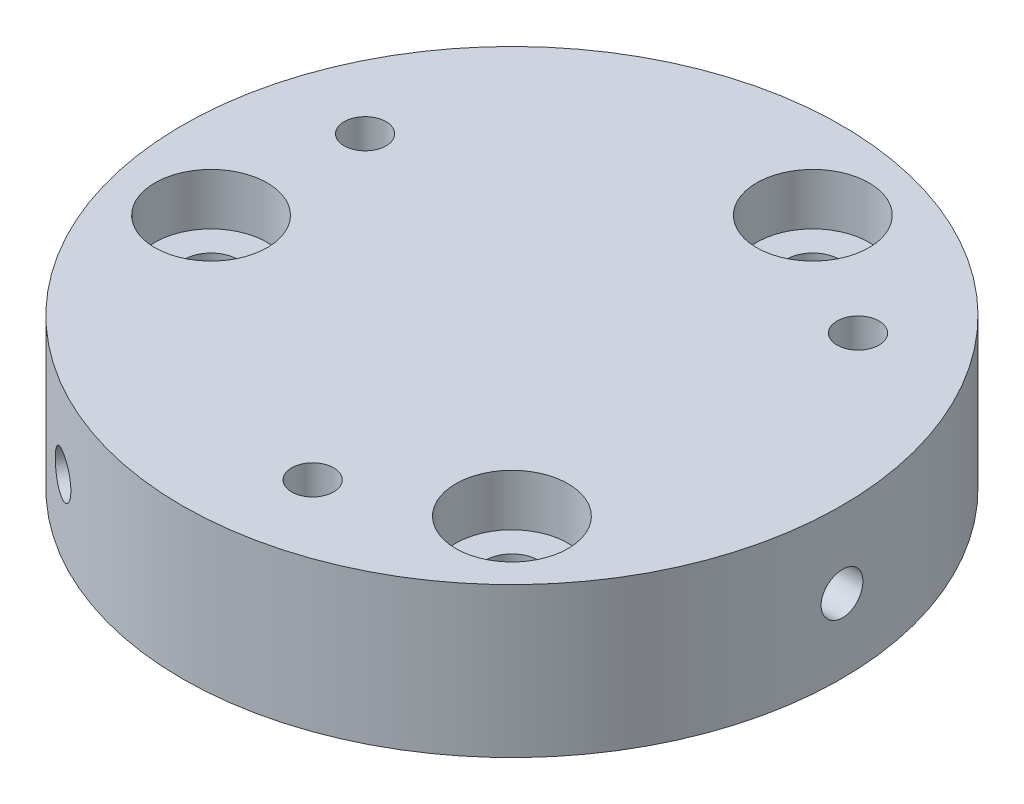
ISO-10303-21;
HEADER;
FILE_DESCRIPTION(('STEP AP214'),'2;1');
FILE_NAME('part.step','',(''),(''),'','','');
FILE_SCHEMA(('AUTOMOTIVE_DESIGN { 1 0 10303 214 1 1 1 1 }'));
ENDSEC;
DATA;
#1=APPLICATION_CONTEXT('core data for automotive mechanical design processes');
#2=APPLICATION_PROTOCOL_DEFINITION('international standard','automotive_design',2000,#1);
#3=PRODUCT_CONTEXT('',#1,'mechanical');
#4=PRODUCT('Part','Part','',(#3));
#5=PRODUCT_RELATED_PRODUCT_CATEGORY('part','',(#4));
#6=PRODUCT_DEFINITION_FORMATION('','',#4);
#7=PRODUCT_DEFINITION_CONTEXT('part definition',#1,'design');
#8=PRODUCT_DEFINITION('design','',#6,#7);
#9=PRODUCT_DEFINITION_SHAPE('','',#8);
#10=(LENGTH_UNIT() NAMED_UNIT(*) SI_UNIT(.MILLI.,.METRE.));
#11=(NAMED_UNIT(*) PLANE_ANGLE_UNIT() SI_UNIT($,.RADIAN.));
#12=(NAMED_UNIT(*) SI_UNIT($,.STERADIAN.) SOLID_ANGLE_UNIT());
#13=UNCERTAINTY_MEASURE_WITH_UNIT(LENGTH_MEASURE(1.E-05),#10,'distance_accuracy_value','');
#14=(GEOMETRIC_REPRESENTATION_CONTEXT(3) GLOBAL_UNCERTAINTY_ASSIGNED_CONTEXT((#13)) GLOBAL_UNIT_ASSIGNED_CONTEXT((#10,
#11,#12)) REPRESENTATION_CONTEXT('',''));
#15=CARTESIAN_POINT('',(0.,0.,0.));
#16=DIRECTION('',(0.,0.,1.));
#17=DIRECTION('',(1.,0.,0.));
#18=AXIS2_PLACEMENT_3D('',#15,#16,#17);
#19=CARTESIAN_POINT('',(0.,6.35,0.));
#20=DIRECTION('',(0.,-1.,0.));
#21=DIRECTION('',(0.,0.,-1.));
#22=AXIS2_PLACEMENT_3D('',#19,#20,#21);
#23=CYLINDRICAL_SURFACE('',#22,13.97);
#24=CARTESIAN_POINT('',(13.938479425979,3.10562907168175,-0.937918595380138));
#25=CARTESIAN_POINT('',(13.9384798123042,3.05574782331363,-0.937916402544638));
#26=CARTESIAN_POINT('',(13.9387647865163,3.00583169363299,-0.933707252486993));
#27=CARTESIAN_POINT('',(13.939875236483,2.90737787517931,-0.916976536175207));
#28=CARTESIAN_POINT('',(13.9407013405568,2.85884185732844,-0.904445306716632));
#29=CARTESIAN_POINT('',(13.9428038338316,2.76458862175944,-0.871431713651232));
#30=CARTESIAN_POINT('',(13.9440799844859,2.71886992577468,-0.850953561726351));
#31=CARTESIAN_POINT('',(13.9469445298876,2.6315314518237,-0.802633914107205));
#32=CARTESIAN_POINT('',(13.9485328533404,2.58991074120227,-0.774794099185005));
#33=CARTESIAN_POINT('',(13.9518537986137,2.51187314480426,-0.712493588303495));
#34=CARTESIAN_POINT('',(13.9535866152013,2.47546346864958,-0.678023871203535));
#35=CARTESIAN_POINT('',(13.9570099140388,2.40894319032042,-0.603460184122266));
#36=CARTESIAN_POINT('',(13.9587003945163,2.37883285146058,-0.563365979152257));
#37=CARTESIAN_POINT('',(13.9618619568109,2.32574383039153,-0.478650327019247));
#38=CARTESIAN_POINT('',(13.9633328547612,2.30277110763143,-0.434025137797455));
#39=CARTESIAN_POINT('',(13.9659009077045,2.26464758936021,-0.341540102584412));
#40=CARTESIAN_POINT('',(13.9669980668175,2.24949670762206,-0.293680292257818));
#41=CARTESIAN_POINT('',(13.9687078069622,2.22746693787532,-0.196153701650536));
#42=CARTESIAN_POINT('',(13.9693210485641,2.22057676690943,-0.146489481746137));
#43=CARTESIAN_POINT('',(13.9700110051462,2.21522916054317,-0.0467057369814023));
#44=CARTESIAN_POINT('',(13.9700877263596,2.21677162717229,0.00341378258250156));
#45=CARTESIAN_POINT('',(13.9697111129552,2.22823620664003,0.102608957958117));
#46=CARTESIAN_POINT('',(13.9692585457138,2.23814618225657,0.151686020226645));
#47=CARTESIAN_POINT('',(13.9678899531263,2.26604563547726,0.247480303593779));
#48=CARTESIAN_POINT('',(13.96697392496,2.28403516224325,0.294197510331397));
#49=CARTESIAN_POINT('',(13.9647941725981,2.3275967941837,0.383984580791216));
#50=CARTESIAN_POINT('',(13.9635301963752,2.35317439663278,0.427051771031658));
#51=CARTESIAN_POINT('',(13.9608094021003,2.41118212611358,0.508286665190614));
#52=CARTESIAN_POINT('',(13.959352581796,2.44361233318274,0.546454311874785));
#53=CARTESIAN_POINT('',(13.9564182317809,2.51447323916838,0.616877067527077));
#54=CARTESIAN_POINT('',(13.9549406699363,2.55291447335717,0.649121575284797));
#55=CARTESIAN_POINT('',(13.9521434922829,2.63466932624759,0.706700524130587));
#56=CARTESIAN_POINT('',(13.9508238765394,2.67798294696504,0.732034962359785));
#57=CARTESIAN_POINT('',(13.9484991294586,2.76825982894961,0.775073463492338));
#58=CARTESIAN_POINT('',(13.94749401673,2.81522330596985,0.792777074910824));
#59=CARTESIAN_POINT('',(13.9459175546699,2.91146366766766,0.820043718673101));
#60=CARTESIAN_POINT('',(13.9453462000475,2.96074052411902,0.829606850314013));
#61=CARTESIAN_POINT('',(13.9447055296932,3.06011636782764,0.840307671547019));
#62=CARTESIAN_POINT('',(13.9446353355671,3.11021376231064,0.841460102822821));
#63=CARTESIAN_POINT('',(13.9450029484655,3.20988989761212,0.835345309247503));
#64=CARTESIAN_POINT('',(13.9454407527484,3.25946864122835,0.828078129838039));
#65=CARTESIAN_POINT('',(13.9467720692114,3.35665840694636,0.805342788637999));
#66=CARTESIAN_POINT('',(13.9476652038716,3.40427102389161,0.789881420328618));
#67=CARTESIAN_POINT('',(13.9498016432069,3.49622622195101,0.751203755551211));
#68=CARTESIAN_POINT('',(13.9510449511741,3.54056877231698,0.727987386174881));
#69=CARTESIAN_POINT('',(13.9537368854457,3.62479280242782,0.674421485897712));
#70=CARTESIAN_POINT('',(13.9551857948497,3.66466799312794,0.644062080931192));
#71=CARTESIAN_POINT('',(13.9581156147561,3.73876202968895,0.577086729976687));
#72=CARTESIAN_POINT('',(13.9595965255828,3.77298081818856,0.540470720548449));
#73=CARTESIAN_POINT('',(13.9624151407836,3.83484051191047,0.461958577705745));
#74=CARTESIAN_POINT('',(13.9637526359541,3.86247187784163,0.420054919798023));
#75=CARTESIAN_POINT('',(13.966118822522,3.91030708757418,0.332195247290731));
#76=CARTESIAN_POINT('',(13.9671475158808,3.93051097855051,0.286239258431476));
#77=CARTESIAN_POINT('',(13.968765848019,3.96290114161872,0.191614828870857));
#78=CARTESIAN_POINT('',(13.9693558171,3.97509344457163,0.142948458461878));
#79=CARTESIAN_POINT('',(13.970017018193,3.99113407245889,0.0442561638739929));
#80=CARTESIAN_POINT('',(13.9700882555308,3.99498248305793,-0.00576974634151527));
#81=CARTESIAN_POINT('',(13.969689516486,3.99422524539626,-0.105666592523406));
#82=CARTESIAN_POINT('',(13.9692204961881,3.98963452316739,-0.155537646134647));
#83=CARTESIAN_POINT('',(13.9677808594512,3.97216028892392,-0.253797491762996));
#84=CARTESIAN_POINT('',(13.966810242138,3.95927676245398,-0.302186281196191));
#85=CARTESIAN_POINT('',(13.9644622259964,3.92558602452528,-0.39611043997639));
#86=CARTESIAN_POINT('',(13.9630848307923,3.90477888366231,-0.441645834741632));
#87=CARTESIAN_POINT('',(13.9600644551051,3.85583360900213,-0.528577829492077));
#88=CARTESIAN_POINT('',(13.9584214813832,3.82769566182573,-0.569974534799046));
#89=CARTESIAN_POINT('',(13.9550391098452,3.76483229364425,-0.647530223113033));
#90=CARTESIAN_POINT('',(13.9532995572277,3.73009606745941,-0.683680440870135));
#91=CARTESIAN_POINT('',(13.9499111124834,3.65503696539072,-0.749649361910175));
#92=CARTESIAN_POINT('',(13.9482622426368,3.61471272505416,-0.779466514300304));
#93=CARTESIAN_POINT('',(13.9452307043887,3.52957466798917,-0.831946288565063));
#94=CARTESIAN_POINT('',(13.9438483768076,3.48475521315877,-0.854599773821329));
#95=CARTESIAN_POINT('',(13.9415039034321,3.3919723790482,-0.892033622069469));
#96=CARTESIAN_POINT('',(13.9405412661698,3.34401275312964,-0.906823198378055));
#97=CARTESIAN_POINT('',(13.9393927137639,3.26407167006489,-0.924269360513818));
#98=CARTESIAN_POINT('',(13.9390517062082,3.23260683983259,-0.929381199691131));
#99=CARTESIAN_POINT('',(13.9385949391526,3.16930910282509,-0.936206514680543));
#100=CARTESIAN_POINT('',(13.9384791793263,3.13747619658315,-0.937919995415388));
#101=CARTESIAN_POINT('',(13.938479425979,3.10562907168175,-0.937918595380138));
#102=B_SPLINE_CURVE_WITH_KNOTS('',3,(#24,#25,#26,#27,#28,#29,#30,#31,#32,#33,#34,#35,#36,#37,
#38,#39,#40,#41,#42,#43,#44,#45,#46,#47,#48,#49,#50,#51,#52,#53,#54,#55,#56,#57,#58,#59,#60,#61,
#62,#63,#64,#65,#66,#67,#68,#69,#70,#71,#72,#73,#74,#75,#76,#77,#78,#79,#80,#81,#82,#83,#84,#85,
#86,#87,#88,#89,#90,#91,#92,#93,#94,#95,#96,#97,#98,#99,#100,#101),.UNSPECIFIED.,.T.,.F.,(4,2,2,
2,2,2,2,2,2,2,2,2,2,2,2,2,2,2,2,2,2,2,2,2,2,2,2,2,2,2,2,2,2,2,2,2,2,2,4),(0.,0.149527482406486,
0.299228893326194,0.448851074132701,0.598439123524548,0.748232172227045,0.898031481084003,
1.04795552866867,1.19787792347314,1.34759531144537,1.49731096000255,1.64680981565275,
1.79630958097426,1.94591791882695,2.09552800418032,2.24540330615919,2.39527867014518,
2.54516290042778,2.69504530240464,2.84466493782343,2.99428376573073,3.14377874412513,
3.2932751280296,3.44297939285704,3.59268517573473,3.74260644935419,3.89252677074566,
4.04233410734991,4.19213990591208,4.34168100249683,4.49122235974983,4.64076238468864,
4.7902986031494,4.94008184311066,5.08990172103222,5.23991191728818,5.38974597291562,
5.4852132569612,5.58068040271604),.UNSPECIFIED.);
#103=CARTESIAN_POINT('',(13.938479425979,3.10562907168175,-0.937918595380138));
#104=VERTEX_POINT('',#103);
#105=EDGE_CURVE('E11',#104,#104,#102,.T.);
#106=ORIENTED_EDGE('',*,*,#105,.T.);
#107=EDGE_LOOP('',(#106));
#108=FACE_BOUND('',#107,.T.);
#109=CARTESIAN_POINT('',(-7.78150104327058,3.10562907168175,-11.6021179753345));
#110=CARTESIAN_POINT('',(-7.78149933738191,3.05574782331363,-11.6021194063196));
#111=CARTESIAN_POINT('',(-7.77799659360969,3.00583169363298,-11.6044707762555));
#112=CARTESIAN_POINT('',(-7.76406259324356,2.90737787517931,-11.6137978122923));
#113=CARTESIAN_POINT('',(-7.75362328222868,2.85884185732844,-11.6207788541356));
#114=CARTESIAN_POINT('',(-7.72608391860123,2.76458862175944,-11.6391064632556));
#115=CARTESIAN_POINT('',(-7.70898739413885,2.71886992577468,-11.6504507181037));
#116=CARTESIAN_POINT('',(-7.66857362449965,2.6315314518237,-11.6770913110015));
#117=CARTESIAN_POINT('',(-7.64525779926677,2.58991074120227,-11.6923867469221));
#118=CARTESIAN_POINT('',(-7.59296444681125,2.51187314480426,-11.7264130253341));
#119=CARTESIAN_POINT('',(-7.56397920443524,2.47546346864958,-11.745148547069));
#120=CARTESIAN_POINT('',(-7.50111680664176,2.40894319032042,-11.7853950543677));
#121=CARTESIAN_POINT('',(-7.46723944683198,2.37883285146058,-11.8069061558909));
#122=CARTESIAN_POINT('',(-7.3954543211339,2.32574383039153,-11.8520019752201));
#123=CARTESIAN_POINT('',(-7.35754322259429,2.30277110763143,-11.8755884048223));
#124=CARTESIAN_POINT('',(-7.27873285910154,2.26464758936021,-11.924054921516));
#125=CARTESIAN_POINT('',(-7.2378336270949,2.24949670762206,-11.9489349943431));
#126=CARTESIAN_POINT('',(-7.15422799215689,2.22746693787532,-11.999178968046));
#127=CARTESIAN_POINT('',(-7.11152413686148,2.22057676690943,-12.0245421608041));
#128=CARTESIAN_POINT('',(-7.0254538573015,2.21522916054317,-12.075031553114));
#129=CARTESIAN_POINT('',(-6.98208744074041,2.21677162717229,-12.1001577554158));
#130=CARTESIAN_POINT('',(-6.89599359223009,2.22823620664003,-12.149429186328));
#131=CARTESIAN_POINT('',(-6.85326532594174,2.23814618225657,-12.1735757827343));
#132=CARTESIAN_POINT('',(-6.76962074671469,2.26604563547726,-12.2202876884696));
#133=CARTESIAN_POINT('',(-6.72870444480296,2.28403516224325,-12.2428529881759));
#134=CARTESIAN_POINT('',(-6.64985668467241,2.3275967941837,-12.2858588024864));
#135=CARTESIAN_POINT('',(-6.61192741574311,2.35317439663278,-12.3062977620878));
#136=CARTESIAN_POINT('',(-6.54021553659025,2.41118212611358,-12.3445589322068));
#137=CARTESIAN_POINT('',(-6.50643297480694,2.44361233318274,-12.3623811121566));
#138=CARTESIAN_POINT('',(-6.44397790440001,2.51447323916838,-12.3950512683261));
#139=CARTESIAN_POINT('',(-6.41531456062699,2.55291447335717,-12.4098939161118));
#140=CARTESIAN_POINT('',(-6.36405113937662,2.63466932624759,-12.436260963628));
#141=CARTESIAN_POINT('',(-6.34145106440781,2.67798294696504,-12.4477853619855));
#142=CARTESIAN_POINT('',(-6.30301625554578,2.76825982894961,-12.4672913225224));
#143=CARTESIAN_POINT('',(-6.28718192195434,2.81522330596985,-12.475272675075));
#144=CARTESIAN_POINT('',(-6.26278008475024,2.91146366766766,-12.487540740764));
#145=CARTESIAN_POINT('',(-6.25421249249828,2.96074052411902,-12.4918274989669));
#146=CARTESIAN_POINT('',(-6.24462497429197,3.06011636782764,-12.4966230727811));
#147=CARTESIAN_POINT('',(-6.24359184246796,3.11021376231065,-12.4971384985226));
#148=CARTESIAN_POINT('',(-6.24907121549232,3.20988989761212,-12.4943994638438));
#149=CARTESIAN_POINT('',(-6.2555836796162,3.25946864122835,-12.4911450237699));
#150=CARTESIAN_POINT('',(-6.27593872089064,3.35665840694636,-12.4809303070473));
#151=CARTESIAN_POINT('',(-6.28977522595395,3.40427102389161,-12.4739731001974));
#152=CARTESIAN_POINT('',(-6.32433928587789,3.49622622195101,-12.4564844785467));
#153=CARTESIAN_POINT('',(-6.34506690552501,3.54056877231698,-12.4459530301428));
#154=CARTESIAN_POINT('',(-6.39280230307743,3.62479280242782,-12.4215013634687));
#155=CARTESIAN_POINT('',(-6.41981877372424,3.66466799312794,-12.4075764533372));
#156=CARTESIAN_POINT('',(-6.47928603903141,3.73876202968895,-12.3766260763273));
#157=CARTESIAN_POINT('',(-6.5117368887948,3.77298081818856,-12.3596005780098));
#158=CARTESIAN_POINT('',(-6.58113970660257,3.83484051191047,-12.3227854989559));
#159=CARTESIAN_POINT('',(-6.61809808644737,3.86247187784163,-12.3029919747971));
#160=CARTESIAN_POINT('',(-6.69536988809082,3.91030708757418,-12.2611113162214));
#161=CARTESIAN_POINT('',(-6.73568328857837,3.93051097855051,-12.2390241963732));
#162=CARTESIAN_POINT('',(-6.81843961446561,3.96290114161872,-12.1931134983364));
#163=CARTESIAN_POINT('',(-6.86088091209023,3.97509344457163,-12.1692912413434));
#164=CARTESIAN_POINT('',(-6.94668154690762,3.99113407245889,-12.120517710993));
#165=CARTESIAN_POINT('',(-6.99004087467059,3.99498248305793,-12.0955664492295));
#166=CARTESIAN_POINT('',(-7.07635471169967,3.99422524539626,-12.0452727079963));
#167=CARTESIAN_POINT('',(-7.11930980089153,3.98963452316739,-12.0199309976978));
#168=CARTESIAN_POINT('',(-7.2036855050092,3.97216028892392,-11.9695543128973));
#169=CARTESIAN_POINT('',(-7.24510611726011,3.95927676245398,-11.9445193389301));
#170=CARTESIAN_POINT('',(-7.32527281672206,3.92558602452528,-11.8955238179129));
#171=CARTESIAN_POINT('',(-7.36401892775805,3.90477888366231,-11.8715632612924));
#172=CARTESIAN_POINT('',(-7.43779405576997,3.85583360900213,-11.8254815418431));
#173=CARTESIAN_POINT('',(-7.47282316733785,3.82769566182573,-11.8033603322087));
#174=CARTESIAN_POINT('',(-7.53829717785672,3.76483229364425,-11.7616532683747));
#175=CARTESIAN_POINT('',(-7.56873440847799,3.73009606745941,-11.7420716627383));
#176=CARTESIAN_POINT('',(-7.62417094758676,3.65503696539072,-11.7061527229903));
#177=CARTESIAN_POINT('',(-7.6491689241018,3.61471272505416,-11.6898161836205));
#178=CARTESIAN_POINT('',(-7.69310197267594,3.52957466798917,-11.6609509073528));
#179=CARTESIAN_POINT('',(-7.71202930260157,3.48475521315877,-11.6484270339231));
#180=CARTESIAN_POINT('',(-7.7432757294581,3.3919723790482,-11.6276797362973));
#181=CARTESIAN_POINT('',(-7.7556025596214,3.34401275312964,-11.6194512798193));
#182=CARTESIAN_POINT('',(-7.77013710302657,3.26407167006489,-11.6097335231903));
#183=CARTESIAN_POINT('',(-7.77439358183635,3.23260683983259,-11.6068822823956));
#184=CARTESIAN_POINT('',(-7.78007609447818,3.16930910282509,-11.603074053027));
#185=CARTESIAN_POINT('',(-7.78150213241031,3.13747619658315,-11.6021170617093));
#186=CARTESIAN_POINT('',(-7.78150104327058,3.10562907168175,-11.6021179753345));
#187=B_SPLINE_CURVE_WITH_KNOTS('',3,(#109,#110,#111,#112,#113,#114,#115,#116,#117,#118,#119,
#120,#121,#122,#123,#124,#125,#126,#127,#128,#129,#130,#131,#132,#133,#134,#135,#136,#137,#138,
#139,#140,#141,#142,#143,#144,#145,#146,#147,#148,#149,#150,#151,#152,#153,#154,#155,#156,#157,
#158,#159,#160,#161,#162,#163,#164,#165,#166,#167,#168,#169,#170,#171,#172,#173,#174,#175,#176,
#177,#178,#179,#180,#181,#182,#183,#184,#185,#186),.UNSPECIFIED.,.T.,.F.,(4,2,2,2,2,2,2,2,2,2,2,
2,2,2,2,2,2,2,2,2,2,2,2,2,2,2,2,2,2,2,2,2,2,2,2,2,2,2,4),(0.,0.149527482406486,
0.299228893326194,0.448851074132701,0.598439123524549,0.748232172227047,0.898031481084003,
1.04795552866867,1.19787792347314,1.34759531144537,1.49731096000255,1.64680981565275,
1.79630958097426,1.94591791882695,2.09552800418032,2.24540330615919,2.39527867014518,
2.54516290042778,2.69504530240464,2.84466493782343,2.99428376573073,3.14377874412513,
3.2932751280296,3.44297939285704,3.59268517573473,3.74260644935419,3.89252677074566,
4.04233410734991,4.19213990591208,4.34168100249683,4.49122235974983,4.64076238468864,
4.7902986031494,4.94008184311066,5.08990172103222,5.23991191728818,5.38974597291562,
5.4852132569612,5.58068040271604),.UNSPECIFIED.);
#188=CARTESIAN_POINT('',(-7.78150104327058,3.10562907168175,-11.6021179753345));
#189=VERTEX_POINT('',#188);
#190=EDGE_CURVE('E51',#189,#189,#187,.T.);
#191=ORIENTED_EDGE('',*,*,#190,.T.);
#192=EDGE_LOOP('',(#191));
#193=FACE_BOUND('',#192,.T.);
#194=CARTESIAN_POINT('',(-6.15697838270837,3.10562907168175,12.5400365707147));
#195=CARTESIAN_POINT('',(-6.1569804749222,3.05574782331363,12.5400358088643));
#196=CARTESIAN_POINT('',(-6.16076819290651,3.00583169363298,12.5381780287426));
#197=CARTESIAN_POINT('',(-6.17581264323941,2.90737787517931,12.5307743484676));
#198=CARTESIAN_POINT('',(-6.18707805832809,2.85884185732844,12.5252241608524));
#199=CARTESIAN_POINT('',(-6.21671991523031,2.76458862175944,12.5105381769069));
#200=CARTESIAN_POINT('',(-6.23509259034695,2.71886992577468,12.5014042798301));
#201=CARTESIAN_POINT('',(-6.27837090538792,2.6315314518237,12.4797252251088));
#202=CARTESIAN_POINT('',(-6.30327505407361,2.58991074120227,12.4671808461072));
#203=CARTESIAN_POINT('',(-6.35888935180236,2.51187314480426,12.4389066136377));
#204=CARTESIAN_POINT('',(-6.38960741076601,2.47546346864958,12.4231724182727));
#205=CARTESIAN_POINT('',(-6.45589310739696,2.40894319032042,12.38885523849));
#206=CARTESIAN_POINT('',(-6.49146094768431,2.37883285146058,12.3702721350432));
#207=CARTESIAN_POINT('',(-6.56640763567694,2.32574383039153,12.3306523022394));
#208=CARTESIAN_POINT('',(-6.60578963216685,2.30277110763143,12.3096135426199));
#209=CARTESIAN_POINT('',(-6.68716804860288,2.26464758936021,12.2655950241005));
#210=CARTESIAN_POINT('',(-6.72916443972251,2.24949670762206,12.242615286601));
#211=CARTESIAN_POINT('',(-6.81447981480529,2.22746693787532,12.1953326696966));
#212=CARTESIAN_POINT('',(-6.85779691170257,2.22057676690943,12.1710316425503));
#213=CARTESIAN_POINT('',(-6.9445571478446,2.21522916054317,12.1217372900955));
#214=CARTESIAN_POINT('',(-6.98800028561913,2.21677162717229,12.0967439728334));
#215=CARTESIAN_POINT('',(-7.07371752072508,2.22823620664003,12.04682022837));
#216=CARTESIAN_POINT('',(-7.11599321977204,2.23814618225657,12.0218897625078));
#217=CARTESIAN_POINT('',(-7.19826920641152,2.26604563547726,11.972807384876));
#218=CARTESIAN_POINT('',(-7.23826948015704,2.28403516224324,11.9486554778446));
#219=CARTESIAN_POINT('',(-7.31493748792566,2.3275967941837,11.9018742216953));
#220=CARTESIAN_POINT('',(-7.35160278063204,2.35317439663278,11.8792459910563));
#221=CARTESIAN_POINT('',(-7.42059386550998,2.41118212611358,11.8362722670162));
#222=CARTESIAN_POINT('',(-7.45291960698899,2.44361233318274,11.8159268002819));
#223=CARTESIAN_POINT('',(-7.51244032738084,2.51447323916838,11.7781742007991));
#224=CARTESIAN_POINT('',(-7.53962610930923,2.55291447335717,11.7607723408271));
#225=CARTESIAN_POINT('',(-7.58809235290619,2.63466932624759,11.7295604394975));
#226=CARTESIAN_POINT('',(-7.60937281213157,2.67798294696504,11.7157503996258));
#227=CARTESIAN_POINT('',(-7.64548287391273,2.76825982894961,11.6922178590301));
#228=CARTESIAN_POINT('',(-7.66031209477556,2.81522330596985,11.6824956001643));
#229=CARTESIAN_POINT('',(-7.68313746991961,2.91146366766766,11.667497022091));
#230=CARTESIAN_POINT('',(-7.69113370754918,2.96074052411902,11.662220648653));
#231=CARTESIAN_POINT('',(-7.70008055540115,3.06011636782764,11.6563154012342));
#232=CARTESIAN_POINT('',(-7.70104349309905,3.11021376231064,11.6556783956999));
#233=CARTESIAN_POINT('',(-7.69593173297317,3.20988989761212,11.6590541545964));
#234=CARTESIAN_POINT('',(-7.68985707313214,3.25946864122835,11.6630668939319));
#235=CARTESIAN_POINT('',(-7.67083334832069,3.35665840694636,11.6755875184094));
#236=CARTESIAN_POINT('',(-7.65788997791762,3.40427102389161,11.6840916798688));
#237=CARTESIAN_POINT('',(-7.62546235732897,3.49622622195101,11.7052807229955));
#238=CARTESIAN_POINT('',(-7.605978045649,3.54056877231698,11.717965643968));
#239=CARTESIAN_POINT('',(-7.5609345823682,3.62479280242782,11.7470798775711));
#240=CARTESIAN_POINT('',(-7.53536702112544,3.66466799312794,11.7635143724061));
#241=CARTESIAN_POINT('',(-7.47882957572464,3.73876202968895,11.7995393463508));
#242=CARTESIAN_POINT('',(-7.44785963678791,3.77298081818856,11.8191298574615));
#243=CARTESIAN_POINT('',(-7.38127543418101,3.83484051191047,11.8608269212503));
#244=CARTESIAN_POINT('',(-7.34565454950665,3.86247187784163,11.8829370549992));
#245=CARTESIAN_POINT('',(-7.2707489344311,3.91030708757418,11.9289160689307));
#246=CARTESIAN_POINT('',(-7.23146422730235,3.93051097855051,11.9527849379418));
#247=CARTESIAN_POINT('',(-7.15032623355338,3.96290114161872,12.0014986694656));
#248=CARTESIAN_POINT('',(-7.10847490500968,3.97509344457163,12.0263427828816));
#249=CARTESIAN_POINT('',(-7.0233354712853,3.99113407245889,12.0762615471191));
#250=CARTESIAN_POINT('',(-6.98004738086013,3.99498248305793,12.1013361955711));
#251=CARTESIAN_POINT('',(-6.89333480478628,3.99422524539626,12.1509393005198));
#252=CARTESIAN_POINT('',(-6.84991069529648,3.98963452316739,12.1754686438325));
#253=CARTESIAN_POINT('',(-6.76409535444198,3.97216028892392,12.2233518046604));
#254=CARTESIAN_POINT('',(-6.72170412487784,3.95927676245398,12.2467056201264));
#255=CARTESIAN_POINT('',(-6.63918940927432,3.92558602452528,12.2916342578894));
#256=CARTESIAN_POINT('',(-6.59906590303421,3.90477888366231,12.3132090960342));
#257=CARTESIAN_POINT('',(-6.52227039933504,3.85583360900213,12.3540593713353));
#258=CARTESIAN_POINT('',(-6.4855983140453,3.82769566182573,12.3733348670079));
#259=CARTESIAN_POINT('',(-6.41674193198837,3.76483229364425,12.4091834914879));
#260=CARTESIAN_POINT('',(-6.38456514874966,3.73009606745941,12.4257521036085));
#261=CARTESIAN_POINT('',(-6.32574016489657,3.65503696539072,12.4558020849006));
#262=CARTESIAN_POINT('',(-6.29909331853489,3.61471272505416,12.4692826979209));
#263=CARTESIAN_POINT('',(-6.25212873171272,3.52957466798917,12.492897195918));
#264=CARTESIAN_POINT('',(-6.23181907420599,3.48475521315877,12.5030268077445));
#265=CARTESIAN_POINT('',(-6.19822817397391,3.3919723790482,12.5197133583669));
#266=CARTESIAN_POINT('',(-6.18493870654833,3.34401275312964,12.5262744781974));
#267=CARTESIAN_POINT('',(-6.16925561073727,3.26407167006489,12.5340028837042));
#268=CARTESIAN_POINT('',(-6.16465812437183,3.23260683983259,12.5362634820868));
#269=CARTESIAN_POINT('',(-6.15851884467434,3.16930910282509,12.5392805677077));
#270=CARTESIAN_POINT('',(-6.15697704691592,3.13747619658315,12.5400370571248));
#271=CARTESIAN_POINT('',(-6.15697838270837,3.10562907168175,12.5400365707147));
#272=B_SPLINE_CURVE_WITH_KNOTS('',3,(#194,#195,#196,#197,#198,#199,#200,#201,#202,#203,#204,
#205,#206,#207,#208,#209,#210,#211,#212,#213,#214,#215,#216,#217,#218,#219,#220,#221,#222,#223,
#224,#225,#226,#227,#228,#229,#230,#231,#232,#233,#234,#235,#236,#237,#238,#239,#240,#241,#242,
#243,#244,#245,#246,#247,#248,#249,#250,#251,#252,#253,#254,#255,#256,#257,#258,#259,#260,#261,
#262,#263,#264,#265,#266,#267,#268,#269,#270,#271),.UNSPECIFIED.,.T.,.F.,(4,2,2,2,2,2,2,2,2,2,2,
2,2,2,2,2,2,2,2,2,2,2,2,2,2,2,2,2,2,2,2,2,2,2,2,2,2,2,4),(0.,0.149527482406486,
0.299228893326194,0.4488510741327,0.598439123524548,0.748232172227044,0.898031481084002,
1.04795552866867,1.19787792347314,1.34759531144537,1.49731096000255,1.64680981565275,
1.79630958097426,1.94591791882695,2.09552800418032,2.24540330615919,2.39527867014518,
2.54516290042778,2.69504530240464,2.84466493782343,2.99428376573073,3.14377874412513,
3.2932751280296,3.44297939285704,3.59268517573473,3.74260644935419,3.89252677074566,
4.04233410734991,4.19213990591208,4.34168100249682,4.49122235974983,4.64076238468864,
4.79029860314939,4.94008184311066,5.08990172103222,5.23991191728818,5.38974597291562,
5.4852132569612,5.58068040271604),.UNSPECIFIED.);
#273=CARTESIAN_POINT('',(-6.15697838270837,3.10562907168175,12.5400365707147));
#274=VERTEX_POINT('',#273);
#275=EDGE_CURVE('E145',#274,#274,#272,.T.);
#276=ORIENTED_EDGE('',*,*,#275,.T.);
#277=EDGE_LOOP('',(#276));
#278=FACE_BOUND('',#277,.T.);
#279=CARTESIAN_POINT('',(0.,6.35,0.));
#280=DIRECTION('',(0.,1.,0.));
#281=DIRECTION('',(0.,0.,1.));
#282=AXIS2_PLACEMENT_3D('',#279,#280,#281);
#283=CIRCLE('',#282,13.97);
#284=CARTESIAN_POINT('',(0.,6.35,13.97));
#285=VERTEX_POINT('',#284);
#286=EDGE_CURVE('E142',#285,#285,#283,.T.);
#287=ORIENTED_EDGE('',*,*,#286,.F.);
#288=EDGE_LOOP('',(#287));
#289=FACE_BOUND('',#288,.T.);
#290=CARTESIAN_POINT('',(0.,0.,0.));
#291=DIRECTION('',(0.,1.,0.));
#292=DIRECTION('',(0.,0.,1.));
#293=AXIS2_PLACEMENT_3D('',#290,#291,#292);
#294=CIRCLE('',#293,13.97);
#295=CARTESIAN_POINT('',(0.,0.,13.97));
#296=VERTEX_POINT('',#295);
#297=EDGE_CURVE('E141',#296,#296,#294,.T.);
#298=ORIENTED_EDGE('',*,*,#297,.T.);
#299=EDGE_LOOP('',(#298));
#300=FACE_BOUND('',#299,.T.);
#301=ADVANCED_FACE('F39',(#108,#193,#278,#289,#300),#23,.T.);
#302=CARTESIAN_POINT('',(0.,6.35,0.));
#303=DIRECTION('',(0.,1.,0.));
#304=DIRECTION('',(0.,0.,1.));
#305=AXIS2_PLACEMENT_3D('',#302,#303,#304);
#306=PLANE('',#305);
#307=CARTESIAN_POINT('',(-9.78595895286442,6.35,-3.56179777259358));
#308=DIRECTION('',(0.,1.,0.));
#309=DIRECTION('',(0.,0.,1.));
#310=AXIS2_PLACEMENT_3D('',#307,#308,#309);
#311=CIRCLE('',#310,0.888999999999999);
#312=CARTESIAN_POINT('',(-9.78595895286442,6.35,-2.67279777259359));
#313=VERTEX_POINT('',#312);
#314=EDGE_CURVE('E87',#313,#313,#311,.T.);
#315=ORIENTED_EDGE('',*,*,#314,.F.);
#316=EDGE_LOOP('',(#315));
#317=FACE_BOUND('',#316,.T.);
#318=CARTESIAN_POINT('',(1.80837212222339,6.35,10.2557879398691));
#319=DIRECTION('',(0.,1.,0.));
#320=DIRECTION('',(0.,0.,1.));
#321=AXIS2_PLACEMENT_3D('',#318,#319,#320);
#322=CIRCLE('',#321,0.889);
#323=CARTESIAN_POINT('',(1.80837212222339,6.35,11.1447879398691));
#324=VERTEX_POINT('',#323);
#325=EDGE_CURVE('E93',#324,#324,#322,.T.);
#326=ORIENTED_EDGE('',*,*,#325,.F.);
#327=EDGE_LOOP('',(#326));
#328=FACE_BOUND('',#327,.T.);
#329=CARTESIAN_POINT('',(7.97758683064102,6.35,-6.69399016727564));
#330=DIRECTION('',(0.,1.,0.));
#331=DIRECTION('',(0.,0.,1.));
#332=AXIS2_PLACEMENT_3D('',#329,#330,#331);
#333=CIRCLE('',#332,0.888999999999999);
#334=CARTESIAN_POINT('',(7.97758683064102,6.35,-5.80499016727564));
#335=VERTEX_POINT('',#334);
#336=EDGE_CURVE('E99',#335,#335,#333,.T.);
#337=ORIENTED_EDGE('',*,*,#336,.F.);
#338=EDGE_LOOP('',(#337));
#339=FACE_BOUND('',#338,.T.);
#340=CARTESIAN_POINT('',(-10.0591515549743,6.35,2.69534153569774));
#341=DIRECTION('',(0.,1.,0.));
#342=DIRECTION('',(0.,0.,1.));
#343=AXIS2_PLACEMENT_3D('',#340,#341,#342);
#344=CIRCLE('',#343,2.38125);
#345=CARTESIAN_POINT('',(-10.0591515549743,6.35,5.07659153569775));
#346=VERTEX_POINT('',#345);
#347=EDGE_CURVE('E105',#346,#346,#344,.T.);
#348=ORIENTED_EDGE('',*,*,#347,.F.);
#349=EDGE_LOOP('',(#348));
#350=FACE_BOUND('',#349,.T.);
#351=CARTESIAN_POINT('',(2.6953415356976,6.35,-10.0591515549744));
#352=DIRECTION('',(0.,1.,0.));
#353=DIRECTION('',(0.,0.,1.));
#354=AXIS2_PLACEMENT_3D('',#351,#352,#353);
#355=CIRCLE('',#354,2.38125);
#356=CARTESIAN_POINT('',(2.6953415356976,6.35,-7.67790155497437));
#357=VERTEX_POINT('',#356);
#358=EDGE_CURVE('E117',#357,#357,#355,.T.);
#359=ORIENTED_EDGE('',*,*,#358,.F.);
#360=EDGE_LOOP('',(#359));
#361=FACE_BOUND('',#360,.T.);
#362=CARTESIAN_POINT('',(7.36381001927671,6.35,7.36381001927671));
#363=DIRECTION('',(0.,1.,0.));
#364=DIRECTION('',(0.,0.,1.));
#365=AXIS2_PLACEMENT_3D('',#362,#363,#364);
#366=CIRCLE('',#365,2.38125);
#367=CARTESIAN_POINT('',(7.36381001927671,6.35,9.74506001927671));
#368=VERTEX_POINT('',#367);
#369=EDGE_CURVE('E129',#368,#368,#366,.T.);
#370=ORIENTED_EDGE('',*,*,#369,.F.);
#371=EDGE_LOOP('',(#370));
#372=FACE_BOUND('',#371,.T.);
#373=ORIENTED_EDGE('',*,*,#286,.T.);
#374=EDGE_LOOP('',(#373));
#375=FACE_BOUND('',#374,.T.);
#376=ADVANCED_FACE('F228',(#317,#328,#339,#350,#361,#372,#375),#306,.T.);
#377=CARTESIAN_POINT('',(0.,0.,0.));
#378=DIRECTION('',(0.,1.,0.));
#379=DIRECTION('',(0.,0.,1.));
#380=AXIS2_PLACEMENT_3D('',#377,#378,#379);
#381=PLANE('',#380);
#382=CARTESIAN_POINT('',(-10.0591515549743,0.,2.69534153569774));
#383=DIRECTION('',(0.,1.,0.));
#384=DIRECTION('',(0.,0.,1.));
#385=AXIS2_PLACEMENT_3D('',#382,#383,#384);
#386=CIRCLE('',#385,1.1303);
#387=CARTESIAN_POINT('',(-10.0591515549743,0.,3.82564153569774));
#388=VERTEX_POINT('',#387);
#389=EDGE_CURVE('E114',#388,#388,#386,.T.);
#390=ORIENTED_EDGE('',*,*,#389,.T.);
#391=EDGE_LOOP('',(#390));
#392=FACE_BOUND('',#391,.T.);
#393=CARTESIAN_POINT('',(2.6953415356976,0.,-10.0591515549744));
#394=DIRECTION('',(0.,1.,0.));
#395=DIRECTION('',(0.,0.,1.));
#396=AXIS2_PLACEMENT_3D('',#393,#394,#395);
#397=CIRCLE('',#396,1.1303);
#398=CARTESIAN_POINT('',(2.6953415356976,0.,-8.92885155497437));
#399=VERTEX_POINT('',#398);
#400=EDGE_CURVE('E126',#399,#399,#397,.T.);
#401=ORIENTED_EDGE('',*,*,#400,.T.);
#402=EDGE_LOOP('',(#401));
#403=FACE_BOUND('',#402,.T.);
#404=CARTESIAN_POINT('',(7.36381001927671,0.,7.36381001927671));
#405=DIRECTION('',(0.,1.,0.));
#406=DIRECTION('',(0.,0.,1.));
#407=AXIS2_PLACEMENT_3D('',#404,#405,#406);
#408=CIRCLE('',#407,1.1303);
#409=CARTESIAN_POINT('',(7.36381001927671,0.,8.4941100192767));
#410=VERTEX_POINT('',#409);
#411=EDGE_CURVE('E138',#410,#410,#408,.T.);
#412=ORIENTED_EDGE('',*,*,#411,.T.);
#413=EDGE_LOOP('',(#412));
#414=FACE_BOUND('',#413,.T.);
#415=ORIENTED_EDGE('',*,*,#297,.F.);
#416=EDGE_LOOP('',(#415));
#417=FACE_BOUND('',#416,.T.);
#418=ADVANCED_FACE('F226',(#392,#403,#414,#417),#381,.F.);
#419=CARTESIAN_POINT('',(7.36381001927671,6.35,7.36381001927671));
#420=DIRECTION('',(0.,1.,0.));
#421=DIRECTION('',(0.,0.,1.));
#422=AXIS2_PLACEMENT_3D('',#419,#420,#421);
#423=CYLINDRICAL_SURFACE('',#422,1.1303);
#424=ORIENTED_EDGE('',*,*,#411,.F.);
#425=EDGE_LOOP('',(#424));
#426=FACE_BOUND('',#425,.T.);
#427=CARTESIAN_POINT('',(7.36381001927671,4.1656,7.36381001927671));
#428=DIRECTION('',(0.,1.,0.));
#429=DIRECTION('',(0.,0.,1.));
#430=AXIS2_PLACEMENT_3D('',#427,#428,#429);
#431=CIRCLE('',#430,1.1303);
#432=CARTESIAN_POINT('',(7.36381001927671,4.1656,8.4941100192767));
#433=VERTEX_POINT('',#432);
#434=EDGE_CURVE('E135',#433,#433,#431,.T.);
#435=ORIENTED_EDGE('',*,*,#434,.T.);
#436=EDGE_LOOP('',(#435));
#437=FACE_BOUND('',#436,.T.);
#438=ADVANCED_FACE('F222',(#426,#437),#423,.F.);
#439=CARTESIAN_POINT('',(8.4941100192767,4.1656,7.36381001927671));
#440=DIRECTION('',(0.,-1.,0.));
#441=DIRECTION('',(0.,0.,-1.));
#442=AXIS2_PLACEMENT_3D('',#439,#440,#441);
#443=PLANE('',#442);
#444=ORIENTED_EDGE('',*,*,#434,.F.);
#445=EDGE_LOOP('',(#444));
#446=FACE_BOUND('',#445,.T.);
#447=CARTESIAN_POINT('',(7.36381001927671,4.1656,7.36381001927671));
#448=DIRECTION('',(0.,1.,0.));
#449=DIRECTION('',(0.,0.,1.));
#450=AXIS2_PLACEMENT_3D('',#447,#448,#449);
#451=CIRCLE('',#450,2.38125);
#452=CARTESIAN_POINT('',(7.36381001927671,4.1656,9.74506001927671));
#453=VERTEX_POINT('',#452);
#454=EDGE_CURVE('E132',#453,#453,#451,.T.);
#455=ORIENTED_EDGE('',*,*,#454,.T.);
#456=EDGE_LOOP('',(#455));
#457=FACE_BOUND('',#456,.T.);
#458=ADVANCED_FACE('F218',(#446,#457),#443,.F.);
#459=CARTESIAN_POINT('',(7.36381001927671,6.35,7.36381001927671));
#460=DIRECTION('',(0.,1.,0.));
#461=DIRECTION('',(0.,0.,1.));
#462=AXIS2_PLACEMENT_3D('',#459,#460,#461);
#463=CYLINDRICAL_SURFACE('',#462,2.38125);
#464=ORIENTED_EDGE('',*,*,#454,.F.);
#465=EDGE_LOOP('',(#464));
#466=FACE_BOUND('',#465,.T.);
#467=ORIENTED_EDGE('',*,*,#369,.T.);
#468=EDGE_LOOP('',(#467));
#469=FACE_BOUND('',#468,.T.);
#470=ADVANCED_FACE('F214',(#466,#469),#463,.F.);
#471=CARTESIAN_POINT('',(2.6953415356976,6.35,-10.0591515549744));
#472=DIRECTION('',(0.,1.,0.));
#473=DIRECTION('',(0.,0.,1.));
#474=AXIS2_PLACEMENT_3D('',#471,#472,#473);
#475=CYLINDRICAL_SURFACE('',#474,1.1303);
#476=ORIENTED_EDGE('',*,*,#400,.F.);
#477=EDGE_LOOP('',(#476));
#478=FACE_BOUND('',#477,.T.);
#479=CARTESIAN_POINT('',(2.6953415356976,4.1656,-10.0591515549744));
#480=DIRECTION('',(0.,1.,0.));
#481=DIRECTION('',(0.,0.,1.));
#482=AXIS2_PLACEMENT_3D('',#479,#480,#481);
#483=CIRCLE('',#482,1.1303);
#484=CARTESIAN_POINT('',(2.6953415356976,4.1656,-8.92885155497437));
#485=VERTEX_POINT('',#484);
#486=EDGE_CURVE('E123',#485,#485,#483,.T.);
#487=ORIENTED_EDGE('',*,*,#486,.T.);
#488=EDGE_LOOP('',(#487));
#489=FACE_BOUND('',#488,.T.);
#490=ADVANCED_FACE('F210',(#478,#489),#475,.F.);
#491=CARTESIAN_POINT('',(3.8256415356976,4.1656,-10.0591515549744));
#492=DIRECTION('',(0.,-1.,0.));
#493=DIRECTION('',(0.,0.,-1.));
#494=AXIS2_PLACEMENT_3D('',#491,#492,#493);
#495=PLANE('',#494);
#496=ORIENTED_EDGE('',*,*,#486,.F.);
#497=EDGE_LOOP('',(#496));
#498=FACE_BOUND('',#497,.T.);
#499=CARTESIAN_POINT('',(2.6953415356976,4.1656,-10.0591515549744));
#500=DIRECTION('',(0.,1.,0.));
#501=DIRECTION('',(0.,0.,1.));
#502=AXIS2_PLACEMENT_3D('',#499,#500,#501);
#503=CIRCLE('',#502,2.38125);
#504=CARTESIAN_POINT('',(2.6953415356976,4.1656,-7.67790155497437));
#505=VERTEX_POINT('',#504);
#506=EDGE_CURVE('E120',#505,#505,#503,.T.);
#507=ORIENTED_EDGE('',*,*,#506,.T.);
#508=EDGE_LOOP('',(#507));
#509=FACE_BOUND('',#508,.T.);
#510=ADVANCED_FACE('F206',(#498,#509),#495,.F.);
#511=CARTESIAN_POINT('',(2.6953415356976,6.35,-10.0591515549744));
#512=DIRECTION('',(0.,1.,0.));
#513=DIRECTION('',(0.,0.,1.));
#514=AXIS2_PLACEMENT_3D('',#511,#512,#513);
#515=CYLINDRICAL_SURFACE('',#514,2.38125);
#516=ORIENTED_EDGE('',*,*,#506,.F.);
#517=EDGE_LOOP('',(#516));
#518=FACE_BOUND('',#517,.T.);
#519=ORIENTED_EDGE('',*,*,#358,.T.);
#520=EDGE_LOOP('',(#519));
#521=FACE_BOUND('',#520,.T.);
#522=ADVANCED_FACE('F202',(#518,#521),#515,.F.);
#523=CARTESIAN_POINT('',(-10.0591515549743,6.35,2.69534153569774));
#524=DIRECTION('',(0.,1.,0.));
#525=DIRECTION('',(0.,0.,1.));
#526=AXIS2_PLACEMENT_3D('',#523,#524,#525);
#527=CYLINDRICAL_SURFACE('',#526,1.1303);
#528=ORIENTED_EDGE('',*,*,#389,.F.);
#529=EDGE_LOOP('',(#528));
#530=FACE_BOUND('',#529,.T.);
#531=CARTESIAN_POINT('',(-10.0591515549743,4.1656,2.69534153569774));
#532=DIRECTION('',(0.,1.,0.));
#533=DIRECTION('',(0.,0.,1.));
#534=AXIS2_PLACEMENT_3D('',#531,#532,#533);
#535=CIRCLE('',#534,1.1303);
#536=CARTESIAN_POINT('',(-10.0591515549743,4.1656,3.82564153569774));
#537=VERTEX_POINT('',#536);
#538=EDGE_CURVE('E111',#537,#537,#535,.T.);
#539=ORIENTED_EDGE('',*,*,#538,.T.);
#540=EDGE_LOOP('',(#539));
#541=FACE_BOUND('',#540,.T.);
#542=ADVANCED_FACE('F198',(#530,#541),#527,.F.);
#543=CARTESIAN_POINT('',(-8.92885155497433,4.1656,2.69534153569774));
#544=DIRECTION('',(0.,-1.,0.));
#545=DIRECTION('',(0.,0.,-1.));
#546=AXIS2_PLACEMENT_3D('',#543,#544,#545);
#547=PLANE('',#546);
#548=ORIENTED_EDGE('',*,*,#538,.F.);
#549=EDGE_LOOP('',(#548));
#550=FACE_BOUND('',#549,.T.);
#551=CARTESIAN_POINT('',(-10.0591515549743,4.1656,2.69534153569774));
#552=DIRECTION('',(0.,1.,0.));
#553=DIRECTION('',(0.,0.,1.));
#554=AXIS2_PLACEMENT_3D('',#551,#552,#553);
#555=CIRCLE('',#554,2.38125);
#556=CARTESIAN_POINT('',(-10.0591515549743,4.1656,5.07659153569775));
#557=VERTEX_POINT('',#556);
#558=EDGE_CURVE('E108',#557,#557,#555,.T.);
#559=ORIENTED_EDGE('',*,*,#558,.T.);
#560=EDGE_LOOP('',(#559));
#561=FACE_BOUND('',#560,.T.);
#562=ADVANCED_FACE('F194',(#550,#561),#547,.F.);
#563=CARTESIAN_POINT('',(-10.0591515549743,6.35,2.69534153569774));
#564=DIRECTION('',(0.,1.,0.));
#565=DIRECTION('',(0.,0.,1.));
#566=AXIS2_PLACEMENT_3D('',#563,#564,#565);
#567=CYLINDRICAL_SURFACE('',#566,2.38125);
#568=ORIENTED_EDGE('',*,*,#558,.F.);
#569=EDGE_LOOP('',(#568));
#570=FACE_BOUND('',#569,.T.);
#571=ORIENTED_EDGE('',*,*,#347,.T.);
#572=EDGE_LOOP('',(#571));
#573=FACE_BOUND('',#572,.T.);
#574=ADVANCED_FACE('F191',(#570,#573),#567,.F.);
#575=CARTESIAN_POINT('',(7.97758683064102,2.286,-6.69399016727564));
#576=DIRECTION('',(0.,1.,0.));
#577=DIRECTION('',(0.,0.,1.));
#578=AXIS2_PLACEMENT_3D('',#575,#576,#577);
#579=CONICAL_SURFACE('',#578,0.888999999999999,1.02974425867665);
#580=CARTESIAN_POINT('',(7.97758683064102,1.7518349096845,-6.69399016727564));
#581=VERTEX_POINT('',#580);
#582=VERTEX_LOOP('',#581);
#583=FACE_BOUND('',#582,.T.);
#584=CARTESIAN_POINT('',(7.97758683064102,2.286,-6.69399016727564));
#585=DIRECTION('',(0.,1.,0.));
#586=DIRECTION('',(0.,0.,1.));
#587=AXIS2_PLACEMENT_3D('',#584,#585,#586);
#588=CIRCLE('',#587,0.888999999999999);
#589=CARTESIAN_POINT('',(7.97758683064102,2.286,-5.80499016727564));
#590=VERTEX_POINT('',#589);
#591=EDGE_CURVE('E102',#590,#590,#588,.T.);
#592=ORIENTED_EDGE('',*,*,#591,.T.);
#593=EDGE_LOOP('',(#592));
#594=FACE_BOUND('',#593,.T.);
#595=ADVANCED_FACE('F187',(#583,#594),#579,.F.);
#596=CARTESIAN_POINT('',(7.97758683064102,6.35,-6.69399016727564));
#597=DIRECTION('',(0.,1.,0.));
#598=DIRECTION('',(0.,0.,1.));
#599=AXIS2_PLACEMENT_3D('',#596,#597,#598);
#600=CYLINDRICAL_SURFACE('',#599,0.888999999999999);
#601=ORIENTED_EDGE('',*,*,#591,.F.);
#602=EDGE_LOOP('',(#601));
#603=FACE_BOUND('',#602,.T.);
#604=ORIENTED_EDGE('',*,*,#336,.T.);
#605=EDGE_LOOP('',(#604));
#606=FACE_BOUND('',#605,.T.);
#607=ADVANCED_FACE('F184',(#603,#606),#600,.F.);
#608=CARTESIAN_POINT('',(1.80837212222339,2.286,10.2557879398691));
#609=DIRECTION('',(0.,1.,0.));
#610=DIRECTION('',(0.,0.,1.));
#611=AXIS2_PLACEMENT_3D('',#608,#609,#610);
#612=CONICAL_SURFACE('',#611,0.888999999999999,1.02974425867665);
#613=CARTESIAN_POINT('',(1.80837212222339,1.7518349096845,10.2557879398691));
#614=VERTEX_POINT('',#613);
#615=VERTEX_LOOP('',#614);
#616=FACE_BOUND('',#615,.T.);
#617=CARTESIAN_POINT('',(1.80837212222339,2.286,10.2557879398691));
#618=DIRECTION('',(0.,1.,0.));
#619=DIRECTION('',(0.,0.,1.));
#620=AXIS2_PLACEMENT_3D('',#617,#618,#619);
#621=CIRCLE('',#620,0.888999999999999);
#622=CARTESIAN_POINT('',(1.80837212222339,2.286,11.1447879398691));
#623=VERTEX_POINT('',#622);
#624=EDGE_CURVE('E96',#623,#623,#621,.T.);
#625=ORIENTED_EDGE('',*,*,#624,.T.);
#626=EDGE_LOOP('',(#625));
#627=FACE_BOUND('',#626,.T.);
#628=ADVANCED_FACE('F180',(#616,#627),#612,.F.);
#629=CARTESIAN_POINT('',(1.80837212222339,6.35,10.2557879398691));
#630=DIRECTION('',(0.,1.,0.));
#631=DIRECTION('',(0.,0.,1.));
#632=AXIS2_PLACEMENT_3D('',#629,#630,#631);
#633=CYLINDRICAL_SURFACE('',#632,0.888999999999999);
#634=ORIENTED_EDGE('',*,*,#624,.F.);
#635=EDGE_LOOP('',(#634));
#636=FACE_BOUND('',#635,.T.);
#637=ORIENTED_EDGE('',*,*,#325,.T.);
#638=EDGE_LOOP('',(#637));
#639=FACE_BOUND('',#638,.T.);
#640=ADVANCED_FACE('F176',(#636,#639),#633,.F.);
#641=CARTESIAN_POINT('',(-9.78595895286442,2.286,-3.56179777259358));
#642=DIRECTION('',(0.,1.,0.));
#643=DIRECTION('',(0.,0.,1.));
#644=AXIS2_PLACEMENT_3D('',#641,#642,#643);
#645=CONICAL_SURFACE('',#644,0.888999999999999,1.02974425867665);
#646=CARTESIAN_POINT('',(-9.78595895286442,1.7518349096845,-3.56179777259358));
#647=VERTEX_POINT('',#646);
#648=VERTEX_LOOP('',#647);
#649=FACE_BOUND('',#648,.T.);
#650=CARTESIAN_POINT('',(-9.78595895286442,2.286,-3.56179777259358));
#651=DIRECTION('',(0.,1.,0.));
#652=DIRECTION('',(0.,0.,1.));
#653=AXIS2_PLACEMENT_3D('',#650,#651,#652);
#654=CIRCLE('',#653,0.888999999999999);
#655=CARTESIAN_POINT('',(-9.78595895286442,2.286,-2.67279777259359));
#656=VERTEX_POINT('',#655);
#657=EDGE_CURVE('E90',#656,#656,#654,.T.);
#658=ORIENTED_EDGE('',*,*,#657,.T.);
#659=EDGE_LOOP('',(#658));
#660=FACE_BOUND('',#659,.T.);
#661=ADVANCED_FACE('F172',(#649,#660),#645,.F.);
#662=CARTESIAN_POINT('',(-9.78595895286442,6.35,-3.56179777259358));
#663=DIRECTION('',(0.,1.,0.));
#664=DIRECTION('',(0.,0.,1.));
#665=AXIS2_PLACEMENT_3D('',#662,#663,#664);
#666=CYLINDRICAL_SURFACE('',#665,0.888999999999999);
#667=ORIENTED_EDGE('',*,*,#657,.F.);
#668=EDGE_LOOP('',(#667));
#669=FACE_BOUND('',#668,.T.);
#670=ORIENTED_EDGE('',*,*,#314,.T.);
#671=EDGE_LOOP('',(#670));
#672=FACE_BOUND('',#671,.T.);
#673=ADVANCED_FACE('F163',(#669,#672),#666,.F.);
#674=CARTESIAN_POINT('',(-6.9425014540397,3.10562907168175,12.1228121143841));
#675=DIRECTION('',(-0.49695787072582,0.,0.867774668173518));
#676=DIRECTION('',(0.867774668173518,0.,0.49695787072582));
#677=AXIS2_PLACEMENT_3D('',#674,#675,#676);
#678=CYLINDRICAL_SURFACE('',#677,0.888999999999998);
#679=CARTESIAN_POINT('',(-3.78681897493075,3.10562907168175,6.61244297148221));
#680=DIRECTION('',(-0.49695787072582,0.,0.867774668173518));
#681=DIRECTION('',(0.867774668173518,0.,0.49695787072582));
#682=AXIS2_PLACEMENT_3D('',#679,#680,#681);
#683=CIRCLE('',#682,0.888999999999998);
#684=CARTESIAN_POINT('',(-3.01536729492449,3.10562907168175,7.05423851855746));
#685=VERTEX_POINT('',#684);
#686=EDGE_CURVE('E82',#685,#685,#683,.T.);
#687=ORIENTED_EDGE('',*,*,#686,.F.);
#688=EDGE_LOOP('',(#687));
#689=FACE_BOUND('',#688,.T.);
#690=ORIENTED_EDGE('',*,*,#275,.F.);
#691=EDGE_LOOP('',(#690));
#692=FACE_BOUND('',#691,.T.);
#693=ADVANCED_FACE('F157',(#689,#692),#678,.F.);
#694=CARTESIAN_POINT('',(-3.78681897493075,3.10562907168175,6.61244297148221));
#695=DIRECTION('',(-0.49695787072582,0.,0.867774668173518));
#696=DIRECTION('',(0.867774668173518,0.,0.49695787072582));
#697=AXIS2_PLACEMENT_3D('',#694,#695,#696);
#698=CONICAL_SURFACE('',#697,0.888999999999998,0.872664625997164);
#699=CARTESIAN_POINT('',(-3.41610849432414,3.10562907168174,5.96511815131787));
#700=VERTEX_POINT('',#699);
#701=VERTEX_LOOP('',#700);
#702=FACE_BOUND('',#701,.T.);
#703=ORIENTED_EDGE('',*,*,#686,.T.);
#704=EDGE_LOOP('',(#703));
#705=FACE_BOUND('',#704,.T.);
#706=ADVANCED_FACE('F162',(#702,#705),#698,.F.);
#707=CARTESIAN_POINT('',(-7.02741252934243,3.10562907168175,-12.0737886822008));
#708=DIRECTION('',(-0.503035972035965,0.,-0.864265474745944));
#709=DIRECTION('',(-0.864265474745944,0.,0.503035972035965));
#710=AXIS2_PLACEMENT_3D('',#707,#708,#709);
#711=CYLINDRICAL_SURFACE('',#710,0.888999999999998);
#712=CARTESIAN_POINT('',(-3.83313410691405,3.10562907168175,-6.5857029175641));
#713=DIRECTION('',(-0.503035972035965,0.,-0.864265474745944));
#714=DIRECTION('',(-0.864265474745944,0.,0.503035972035965));
#715=AXIS2_PLACEMENT_3D('',#712,#713,#714);
#716=CIRCLE('',#715,0.888999999999998);
#717=CARTESIAN_POINT('',(-4.6014661139632,3.10562907168175,-6.13850393842413));
#718=VERTEX_POINT('',#717);
#719=EDGE_CURVE('E79',#718,#718,#716,.T.);
#720=ORIENTED_EDGE('',*,*,#719,.F.);
#721=EDGE_LOOP('',(#720));
#722=FACE_BOUND('',#721,.T.);
#723=ORIENTED_EDGE('',*,*,#190,.F.);
#724=EDGE_LOOP('',(#723));
#725=FACE_BOUND('',#724,.T.);
#726=ADVANCED_FACE('F168',(#722,#725),#711,.F.);
#727=CARTESIAN_POINT('',(-3.83313410691405,3.10562907168175,-6.5857029175641));
#728=DIRECTION('',(-0.503035972035965,0.,-0.864265474745944));
#729=DIRECTION('',(-0.864265474745944,0.,0.503035972035965));
#730=AXIS2_PLACEMENT_3D('',#727,#728,#729);
#731=CONICAL_SURFACE('',#730,0.888999999999998,0.872664625997163);
#732=CARTESIAN_POINT('',(-3.45788960845485,3.10562907168174,-5.94099581382746));
#733=VERTEX_POINT('',#732);
#734=VERTEX_LOOP('',#733);
#735=FACE_BOUND('',#734,.T.);
#736=ORIENTED_EDGE('',*,*,#719,.T.);
#737=EDGE_LOOP('',(#736));
#738=FACE_BOUND('',#737,.T.);
#739=ADVANCED_FACE('F165',(#735,#738),#731,.F.);
#740=CARTESIAN_POINT('',(13.9699139833822,3.10562907168175,-0.0490234321831118));
#741=DIRECTION('',(0.999993842761788,0.,-0.00350919342756717));
#742=DIRECTION('',(-0.00350919342756717,0.,-0.999993842761788));
#743=AXIS2_PLACEMENT_3D('',#740,#741,#742);
#744=CYLINDRICAL_SURFACE('',#743,0.888999999999998);
#745=CARTESIAN_POINT('',(7.61995308184483,3.10562907168175,-0.0267400539180603));
#746=DIRECTION('',(0.999993842761788,0.,-0.00350919342756717));
#747=DIRECTION('',(-0.00350919342756717,0.,-0.999993842761788));
#748=AXIS2_PLACEMENT_3D('',#745,#746,#747);
#749=CIRCLE('',#748,0.888999999999998);
#750=CARTESIAN_POINT('',(7.61683340888772,3.10562907168175,-0.915734580133288));
#751=VERTEX_POINT('',#750);
#752=EDGE_CURVE('E77',#751,#751,#749,.T.);
#753=ORIENTED_EDGE('',*,*,#752,.F.);
#754=EDGE_LOOP('',(#753));
#755=FACE_BOUND('',#754,.T.);
#756=ORIENTED_EDGE('',*,*,#105,.F.);
#757=EDGE_LOOP('',(#756));
#758=FACE_BOUND('',#757,.T.);
#759=ADVANCED_FACE('F73',(#755,#758),#744,.F.);
#760=CARTESIAN_POINT('',(7.61995308184483,3.10562907168175,-0.0267400539180603));
#761=DIRECTION('',(0.999993842761788,0.,-0.00350919342756717));
#762=DIRECTION('',(-0.00350919342756717,0.,-0.999993842761788));
#763=AXIS2_PLACEMENT_3D('',#760,#761,#762);
#764=CONICAL_SURFACE('',#763,0.888999999999998,0.872664625997163);
#765=CARTESIAN_POINT('',(6.87399810277901,3.10562907168174,-0.0241223374903579));
#766=VERTEX_POINT('',#765);
#767=VERTEX_LOOP('',#766);
#768=FACE_BOUND('',#767,.T.);
#769=ORIENTED_EDGE('',*,*,#752,.T.);
#770=EDGE_LOOP('',(#769));
#771=FACE_BOUND('',#770,.T.);
#772=ADVANCED_FACE('F70',(#768,#771),#764,.F.);
#773=CLOSED_SHELL('',(#301,#376,#418,#438,#458,#470,#490,#510,#522,#542,#562,#574,#595,#607,
#628,#640,#661,#673,#693,#706,#726,#739,#759,#772));
#774=MANIFOLD_SOLID_BREP('B2',#773);
#775=ADVANCED_BREP_SHAPE_REPRESENTATION('',(#18,#774),#14);
#776=SHAPE_DEFINITION_REPRESENTATION(#9,#775);
ENDSEC;
END-ISO-10303-21;
